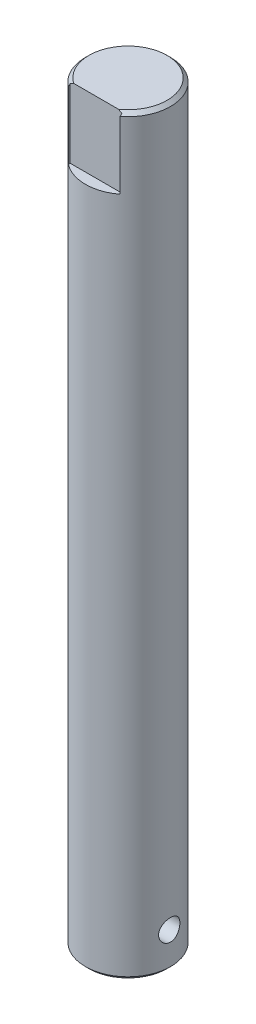
ISO-10303-21;
HEADER;
FILE_DESCRIPTION(('STEP AP214'),'2;1');
FILE_NAME('part.step','',(''),(''),'','','');
FILE_SCHEMA(('AUTOMOTIVE_DESIGN { 1 0 10303 214 1 1 1 1 }'));
ENDSEC;
DATA;
#1=APPLICATION_CONTEXT('core data for automotive mechanical design processes');
#2=APPLICATION_PROTOCOL_DEFINITION('international standard','automotive_design',2000,#1);
#3=PRODUCT_CONTEXT('',#1,'mechanical');
#4=PRODUCT('Part','Part','',(#3));
#5=PRODUCT_RELATED_PRODUCT_CATEGORY('part','',(#4));
#6=PRODUCT_DEFINITION_FORMATION('','',#4);
#7=PRODUCT_DEFINITION_CONTEXT('part definition',#1,'design');
#8=PRODUCT_DEFINITION('design','',#6,#7);
#9=PRODUCT_DEFINITION_SHAPE('','',#8);
#10=(LENGTH_UNIT() NAMED_UNIT(*) SI_UNIT(.MILLI.,.METRE.));
#11=(NAMED_UNIT(*) PLANE_ANGLE_UNIT() SI_UNIT($,.RADIAN.));
#12=(NAMED_UNIT(*) SI_UNIT($,.STERADIAN.) SOLID_ANGLE_UNIT());
#13=UNCERTAINTY_MEASURE_WITH_UNIT(LENGTH_MEASURE(1.E-05),#10,'distance_accuracy_value','');
#14=(GEOMETRIC_REPRESENTATION_CONTEXT(3) GLOBAL_UNCERTAINTY_ASSIGNED_CONTEXT((#13)) GLOBAL_UNIT_ASSIGNED_CONTEXT((#10,
#11,#12)) REPRESENTATION_CONTEXT('',''));
#15=CARTESIAN_POINT('',(0.,0.,0.));
#16=DIRECTION('',(0.,0.,1.));
#17=DIRECTION('',(1.,0.,0.));
#18=AXIS2_PLACEMENT_3D('',#15,#16,#17);
#19=CARTESIAN_POINT('',(0.,106.,0.));
#20=DIRECTION('',(0.,-1.,0.));
#21=DIRECTION('',(0.,0.,-1.));
#22=AXIS2_PLACEMENT_3D('',#19,#20,#21);
#23=CYLINDRICAL_SURFACE('',#22,6.);
#24=CARTESIAN_POINT('',(-6.,3.5,0.));
#25=CARTESIAN_POINT('',(-5.99999859868012,3.50000232573816,-0.082876088669731));
#26=CARTESIAN_POINT('',(-5.99826578131828,3.50689155077379,-0.165778157830763));
#27=CARTESIAN_POINT('',(-5.99152113829892,3.534225151307,-0.329206323770533));
#28=CARTESIAN_POINT('',(-5.98650745419968,3.55467720953785,-0.409731046870739));
#29=CARTESIAN_POINT('',(-5.9737562633204,3.60843925346209,-0.566020872182577));
#30=CARTESIAN_POINT('',(-5.96602202842087,3.64173379871528,-0.641791563430003));
#31=CARTESIAN_POINT('',(-5.94865343807593,3.72018139004483,-0.786672131904427));
#32=CARTESIAN_POINT('',(-5.9390190185405,3.76533483611894,-0.85578178434876));
#33=CARTESIAN_POINT('',(-5.91867413591801,3.86720078965421,-0.98680192730092));
#34=CARTESIAN_POINT('',(-5.90794707148533,3.92411157495918,-1.04855569006107));
#35=CARTESIAN_POINT('',(-5.88673620117529,4.04745220490892,-1.1617489272033));
#36=CARTESIAN_POINT('',(-5.87625242288348,4.1138831229465,-1.21318723694914));
#37=CARTESIAN_POINT('',(-5.8565477569971,4.25559522673744,-1.30502654279903));
#38=CARTESIAN_POINT('',(-5.84734794470605,4.3309932308104,-1.34525221592536));
#39=CARTESIAN_POINT('',(-5.83149494812223,4.48774841165836,-1.41239690855053));
#40=CARTESIAN_POINT('',(-5.82484135672789,4.56910463332576,-1.43931805543933));
#41=CARTESIAN_POINT('',(-5.81500476717551,4.73374349820248,-1.47855483680429));
#42=CARTESIAN_POINT('',(-5.81175491075426,4.8169548960498,-1.49115226833334));
#43=CARTESIAN_POINT('',(-5.80889362537741,4.98436856901398,-1.50226177506785));
#44=CARTESIAN_POINT('',(-5.80928160448643,5.06857068069861,-1.50077614181798));
#45=CARTESIAN_POINT('',(-5.81359205496618,5.23341580774448,-1.48398652463928));
#46=CARTESIAN_POINT('',(-5.81742863001879,5.3140956214651,-1.46901834019052));
#47=CARTESIAN_POINT('',(-5.82806709676483,5.47176105091129,-1.42622418690311));
#48=CARTESIAN_POINT('',(-5.83486919970696,5.54874640302898,-1.39839730206942));
#49=CARTESIAN_POINT('',(-5.85075113904186,5.69773801625207,-1.33038947793715));
#50=CARTESIAN_POINT('',(-5.85985327469421,5.76968617178955,-1.29008666723291));
#51=CARTESIAN_POINT('',(-5.87929710846386,5.90591870975684,-1.19835627601495));
#52=CARTESIAN_POINT('',(-5.88963902334735,5.97020174806726,-1.14692674880884));
#53=CARTESIAN_POINT('',(-5.91075880539781,6.0912036156944,-1.03266342468122));
#54=CARTESIAN_POINT('',(-5.92154069477971,6.14765449006135,-0.96954625816586));
#55=CARTESIAN_POINT('',(-5.94205965578786,6.24922124246391,-0.8346119175037));
#56=CARTESIAN_POINT('',(-5.95179669549415,6.29433677426357,-0.762794477707944));
#57=CARTESIAN_POINT('',(-5.96917732094182,6.37205058622439,-0.612115888681392));
#58=CARTESIAN_POINT('',(-5.97681360127725,6.40460534025443,-0.533231393208624));
#59=CARTESIAN_POINT('',(-5.98907916991418,6.45591730570957,-0.370876008142883));
#60=CARTESIAN_POINT('',(-5.99370903339281,6.47467715641814,-0.287405999150485));
#61=CARTESIAN_POINT('',(-5.99935499271374,6.49745756555884,-0.120539970390027));
#62=CARTESIAN_POINT('',(-6.00046053508278,6.5018430260753,-0.0371967199882097));
#63=CARTESIAN_POINT('',(-5.99918804814451,6.49675099794451,0.129032874801508));
#64=CARTESIAN_POINT('',(-5.99681033241846,6.48727475720087,0.211919259644595));
#65=CARTESIAN_POINT('',(-5.98889581127357,6.45502909160862,0.373614268776491));
#66=CARTESIAN_POINT('',(-5.98340634185811,6.43245873652301,0.452465118968754));
#67=CARTESIAN_POINT('',(-5.96988706634134,6.37489291597155,0.605257292452511));
#68=CARTESIAN_POINT('',(-5.96185700369892,6.33989619568683,0.679198119032634));
#69=CARTESIAN_POINT('',(-5.9439330792631,6.25776387112527,0.821523134429847));
#70=CARTESIAN_POINT('',(-5.93400867366932,6.21042388760324,0.88978544183583));
#71=CARTESIAN_POINT('',(-5.91344509187419,6.10521009120303,1.01752661364325));
#72=CARTESIAN_POINT('',(-5.90280579251705,6.04733446038309,1.07700395897301));
#73=CARTESIAN_POINT('',(-5.88168956960771,5.92099803915554,1.18699056807273));
#74=CARTESIAN_POINT('',(-5.87122304187281,5.85231229699758,1.23724386762203));
#75=CARTESIAN_POINT('',(-5.85192878377239,5.70726736553428,1.3255107590127));
#76=CARTESIAN_POINT('',(-5.84310098067026,5.63090851704025,1.36352489415794));
#77=CARTESIAN_POINT('',(-5.82818094734665,5.47309427758692,1.42595142060929));
#78=CARTESIAN_POINT('',(-5.82207255291905,5.39167237165599,1.45044439665407));
#79=CARTESIAN_POINT('',(-5.81326744090183,5.22569036211089,1.48534565995378));
#80=CARTESIAN_POINT('',(-5.81056997719936,5.14113094896751,1.49575702747866));
#81=CARTESIAN_POINT('',(-5.80894901203957,4.9738789761448,1.50203859033399));
#82=CARTESIAN_POINT('',(-5.80991932728263,4.89120256487527,1.49831789778012));
#83=CARTESIAN_POINT('',(-5.81527909007842,4.72769611133202,1.47737727831287));
#84=CARTESIAN_POINT('',(-5.81966846891856,4.64686603198635,1.46015762268677));
#85=CARTESIAN_POINT('',(-5.83131260682722,4.48979154093459,1.41293131944279));
#86=CARTESIAN_POINT('',(-5.83855015236309,4.41352269475979,1.38300140468038));
#87=CARTESIAN_POINT('',(-5.85507755724829,4.26703461728631,1.31126491360507));
#88=CARTESIAN_POINT('',(-5.86436770120773,4.19681622681308,1.26945669003419));
#89=CARTESIAN_POINT('',(-5.88425634263512,4.06244537099798,1.17386774863714));
#90=CARTESIAN_POINT('',(-5.89488264831757,3.99849892657604,1.11980316291225));
#91=CARTESIAN_POINT('',(-5.91608027246285,3.88045295520459,1.00178937118974));
#92=CARTESIAN_POINT('',(-5.92665157727059,3.82635576988703,0.937837821261146));
#93=CARTESIAN_POINT('',(-5.94677655647663,3.72858869143539,0.80046758670259));
#94=CARTESIAN_POINT('',(-5.95630833365868,3.68512538632842,0.726898422316387));
#95=CARTESIAN_POINT('',(-5.97304924975118,3.61125253705947,0.573266059510477));
#96=CARTESIAN_POINT('',(-5.98026005199781,3.58083363935146,0.49320756343674));
#97=CARTESIAN_POINT('',(-5.99048059565541,3.53842816967035,0.344410253243472));
#98=CARTESIAN_POINT('',(-5.9940258505269,3.52404875694657,0.276380170908069));
#99=CARTESIAN_POINT('',(-5.99878605231948,3.50483405637806,0.138906071536283));
#100=CARTESIAN_POINT('',(-6.00000117450894,3.4999980506947,0.0694621612426163));
#101=CARTESIAN_POINT('',(-6.,3.5,0.));
#102=B_SPLINE_CURVE_WITH_KNOTS('',3,(#24,#25,#26,#27,#28,#29,#30,#31,#32,#33,#34,#35,#36,#37,
#38,#39,#40,#41,#42,#43,#44,#45,#46,#47,#48,#49,#50,#51,#52,#53,#54,#55,#56,#57,#58,#59,#60,#61,
#62,#63,#64,#65,#66,#67,#68,#69,#70,#71,#72,#73,#74,#75,#76,#77,#78,#79,#80,#81,#82,#83,#84,#85,
#86,#87,#88,#89,#90,#91,#92,#93,#94,#95,#96,#97,#98,#99,#100,#101),.UNSPECIFIED.,.T.,.F.,(4,2,2,
2,2,2,2,2,2,2,2,2,2,2,2,2,2,2,2,2,2,2,2,2,2,2,2,2,2,2,2,2,2,2,2,2,2,2,4),(0.,0.24837371247189,
0.4968882377639,0.745104902286106,0.993329940169328,1.24614435437139,1.49898729580062,
1.75558647545807,2.01214461169369,2.2635629509943,2.51494038112697,2.76022497007018,
3.00552703466038,3.25330527873879,3.50112690836163,3.75601500969019,4.01091089558247,
4.26668229009114,4.52240473688643,4.77158308949276,5.02073901112743,5.26620274514037,
5.51169127322291,5.76153587565352,6.01142363008019,6.26744509204476,6.52345518749508,
6.77792254614037,7.03233423252408,7.27943780398613,7.52653640956034,7.77216400559447,
8.01782568136901,8.2698957640991,8.52202569770418,8.77872185499588,9.0352336382135,
9.24342242942149,9.4515955604304),.UNSPECIFIED.);
#103=CARTESIAN_POINT('',(-6.,3.5,0.));
#104=VERTEX_POINT('',#103);
#105=EDGE_CURVE('E157',#104,#104,#102,.T.);
#106=ORIENTED_EDGE('',*,*,#105,.T.);
#107=EDGE_LOOP('',(#106));
#108=FACE_BOUND('',#107,.T.);
#109=CARTESIAN_POINT('',(5.80947501931112,5.,-1.5));
#110=CARTESIAN_POINT('',(5.80947660051185,4.91716954944523,-1.49999764715507));
#111=CARTESIAN_POINT('',(5.81126583608348,4.8343130607932,-1.49311574729838));
#112=CARTESIAN_POINT('',(5.81821117195949,4.67097945309558,-1.46581387527848));
#113=CARTESIAN_POINT('',(5.82336923173088,4.590503747319,-1.44538602404532));
#114=CARTESIAN_POINT('',(5.8364323475758,4.43431787708778,-1.39169471977917));
#115=CARTESIAN_POINT('',(5.84433385614245,4.3586017067686,-1.35844783671268));
#116=CARTESIAN_POINT('',(5.86198915217285,4.21381348847605,-1.28011268475685));
#117=CARTESIAN_POINT('',(5.87174301827101,4.14474172275186,-1.23502391313642));
#118=CARTESIAN_POINT('',(5.89224429813367,4.01368301284268,-1.13322505638713));
#119=CARTESIAN_POINT('',(5.90300758573818,3.95186383978997,-1.07630213262243));
#120=CARTESIAN_POINT('',(5.92417725309178,3.83854316338379,-0.952909238460399));
#121=CARTESIAN_POINT('',(5.93458359939834,3.78704262462695,-0.886438376508184));
#122=CARTESIAN_POINT('',(5.95404249312349,3.69513471942123,-0.744687120647373));
#123=CARTESIAN_POINT('',(5.96307412440355,3.65489216710312,-0.669296745717072));
#124=CARTESIAN_POINT('',(5.9785848715559,3.58771421350815,-0.512557910575657));
#125=CARTESIAN_POINT('',(5.98506436400607,3.56077684885069,-0.431210331475164));
#126=CARTESIAN_POINT('',(5.99462855308908,3.52151129925285,-0.266615255252497));
#127=CARTESIAN_POINT('',(5.99777936306588,3.50889821340405,-0.183439631729385));
#128=CARTESIAN_POINT('',(6.00056156464378,3.49774497243467,-0.0160972915576618));
#129=CARTESIAN_POINT('',(6.00019347658022,3.49920273667424,0.068069276722841));
#130=CARTESIAN_POINT('',(5.99602856972121,3.51594491015009,0.233028370758581));
#131=CARTESIAN_POINT('',(5.99230801404524,3.53092179503231,0.3138543234016));
#132=CARTESIAN_POINT('',(5.98194501914912,3.5737827620291,0.471807371120529));
#133=CARTESIAN_POINT('',(5.97530242439064,3.60166753122645,0.548934269055657));
#134=CARTESIAN_POINT('',(5.95972505820537,3.66980154241224,0.69811005525271));
#135=CARTESIAN_POINT('',(5.95077011817032,3.71016022679705,0.770106764649757));
#136=CARTESIAN_POINT('',(5.93153942285789,3.80201340746975,0.906413433510733));
#137=CARTESIAN_POINT('',(5.92126343791494,3.85350984113637,0.970722052628258));
#138=CARTESIAN_POINT('',(5.90018228261712,3.96782524518943,1.09166105262743));
#139=CARTESIAN_POINT('',(5.88937031715551,4.03091293540866,1.1480365186128));
#140=CARTESIAN_POINT('',(5.86869026110024,4.16575998412415,1.24946456394453));
#141=CARTESIAN_POINT('',(5.85882221463582,4.2375197476946,1.29451661406902));
#142=CARTESIAN_POINT('',(5.84112298098989,4.38817402048938,1.3721821935339));
#143=CARTESIAN_POINT('',(5.83330190235432,4.46710143818792,1.40473435045574));
#144=CARTESIAN_POINT('',(5.82071184083974,4.62955128084587,1.45602843095451));
#145=CARTESIAN_POINT('',(5.81594220486131,4.71307271838988,1.47477330982936));
#146=CARTESIAN_POINT('',(5.81013213623484,4.87997570091387,1.49749778319911));
#147=CARTESIAN_POINT('',(5.80899653456189,4.96330267599778,1.50185428435178));
#148=CARTESIAN_POINT('',(5.81032406088623,5.12949316194689,1.49671019430933));
#149=CARTESIAN_POINT('',(5.81278685760759,5.21235671477074,1.48721087870928));
#150=CARTESIAN_POINT('',(5.82094249172736,5.37386855897282,1.4549552783626));
#151=CARTESIAN_POINT('',(5.82658182140625,5.45256363594251,1.43241844096905));
#152=CARTESIAN_POINT('',(5.84040430962577,5.60505887471101,1.37497084900237));
#153=CARTESIAN_POINT('',(5.84858776949168,5.6788584554332,1.34005862862753));
#154=CARTESIAN_POINT('',(5.86677682255957,5.82106476672041,1.25806240076193));
#155=CARTESIAN_POINT('',(5.87681501163985,5.88933730402586,1.21075305230138));
#156=CARTESIAN_POINT('',(5.89750249843029,6.01711301768081,1.10559043940168));
#157=CARTESIAN_POINT('',(5.90815189637082,6.07661474999004,1.04773544220816));
#158=CARTESIAN_POINT('',(5.92918441818963,6.18668662554257,0.921394081477089));
#159=CARTESIAN_POINT('',(5.93955421237101,6.23699603752929,0.852677928797389));
#160=CARTESIAN_POINT('',(5.9585832996824,6.32536152017075,0.707554024042013));
#161=CARTESIAN_POINT('',(5.96724268202376,6.36341822996492,0.631146673436387));
#162=CARTESIAN_POINT('',(5.98182069442988,6.42586762071676,0.473337302596636));
#163=CARTESIAN_POINT('',(5.98775898013446,6.45035857062744,0.391976071541822));
#164=CARTESIAN_POINT('',(5.99631176037473,6.48527620076505,0.226124640478212));
#165=CARTESIAN_POINT('',(5.99892689636045,6.49570559524343,0.141635047561866));
#166=CARTESIAN_POINT('',(6.00051254113217,6.5020513843633,-0.0256252896649888));
#167=CARTESIAN_POINT('',(5.99957968320012,6.49835256364309,-0.108380740449049));
#168=CARTESIAN_POINT('',(5.99438844686135,6.4774282590585,-0.272051244622109));
#169=CARTESIAN_POINT('',(5.99013016735642,6.46020317748035,-0.352966352671329));
#170=CARTESIAN_POINT('',(5.97878149280944,6.41292167034361,-0.510256553467223));
#171=CARTESIAN_POINT('',(5.97170646753999,6.38293482002806,-0.586653741871528));
#172=CARTESIAN_POINT('',(5.95546933370076,6.31104413147101,-0.733375579562202));
#173=CARTESIAN_POINT('',(5.94630696206604,6.26913879099565,-0.803699461897577));
#174=CARTESIAN_POINT('',(5.92660874521999,6.17342714900439,-0.938102892635848));
#175=CARTESIAN_POINT('',(5.91604525418417,6.11935978563893,-1.00199248245088));
#176=CARTESIAN_POINT('',(5.89485973579863,6.0013657220393,-1.11992253040688));
#177=CARTESIAN_POINT('',(5.88423769428833,5.93743652585314,-1.17396048760228));
#178=CARTESIAN_POINT('',(5.86391213790822,5.800097878698,-1.27164303971884));
#179=CARTESIAN_POINT('',(5.85422945594827,5.72653381488106,-1.31507492916982));
#180=CARTESIAN_POINT('',(5.83715933325923,5.57291676511595,-1.3888903449235));
#181=CARTESIAN_POINT('',(5.82977022370054,5.49286855083989,-1.41928336463958));
#182=CARTESIAN_POINT('',(5.81927863109675,5.34413448225993,-1.46163379284816));
#183=CARTESIAN_POINT('',(5.8156299450082,5.27616025342421,-1.47598975589307));
#184=CARTESIAN_POINT('',(5.81072757878358,5.13879669650006,-1.4951734388599));
#185=CARTESIAN_POINT('',(5.80947369434945,5.06940748963241,-1.50000197155828));
#186=CARTESIAN_POINT('',(5.80947501931112,5.,-1.5));
#187=B_SPLINE_CURVE_WITH_KNOTS('',3,(#109,#110,#111,#112,#113,#114,#115,#116,#117,#118,#119,
#120,#121,#122,#123,#124,#125,#126,#127,#128,#129,#130,#131,#132,#133,#134,#135,#136,#137,#138,
#139,#140,#141,#142,#143,#144,#145,#146,#147,#148,#149,#150,#151,#152,#153,#154,#155,#156,#157,
#158,#159,#160,#161,#162,#163,#164,#165,#166,#167,#168,#169,#170,#171,#172,#173,#174,#175,#176,
#177,#178,#179,#180,#181,#182,#183,#184,#185,#186),.UNSPECIFIED.,.T.,.F.,(4,2,2,2,2,2,2,2,2,2,2,
2,2,2,2,2,2,2,2,2,2,2,2,2,2,2,2,2,2,2,2,2,2,2,2,2,2,2,4),(0.,0.248236465041681,0.4966174448572,
0.744678436299612,0.99274996053287,1.24574372515786,1.4987611288792,1.75530897838752,
2.01181895908255,2.26313250597208,2.51440889199612,2.76010957613368,3.00582334034872,
3.25375724552667,3.50173431281348,3.75642279943147,4.01112318719881,4.26705859205041,
4.52293920077728,4.7720614485703,5.02116076310281,5.26618443005524,5.5112371285285,
5.76109707515494,6.01099811331027,6.26715198579191,6.52329249431732,6.77755243684158,
7.03176329345423,7.27910067676474,7.52643070426189,7.77242925935826,8.01845883442843,
8.27038257949242,8.52237018939305,8.77905886370806,9.03556032819972,9.24358696306398,
9.45159585059712),.UNSPECIFIED.);
#188=CARTESIAN_POINT('',(5.80947501931112,5.,-1.5));
#189=VERTEX_POINT('',#188);
#190=EDGE_CURVE('E148',#189,#189,#187,.T.);
#191=ORIENTED_EDGE('',*,*,#190,.T.);
#192=EDGE_LOOP('',(#191));
#193=FACE_BOUND('',#192,.T.);
#194=CARTESIAN_POINT('',(0.,0.499999999999987,0.));
#195=DIRECTION('',(0.,1.,0.));
#196=DIRECTION('',(0.,0.,1.));
#197=AXIS2_PLACEMENT_3D('',#194,#195,#196);
#198=CIRCLE('',#197,6.);
#199=CARTESIAN_POINT('',(0.,0.499999999999987,6.));
#200=VERTEX_POINT('',#199);
#201=EDGE_CURVE('E136',#200,#200,#198,.T.);
#202=ORIENTED_EDGE('',*,*,#201,.T.);
#203=EDGE_LOOP('',(#202));
#204=FACE_BOUND('',#203,.T.);
#205=DIRECTION('',(0.,-1.,0.));
#206=VECTOR('',#205,1.);
#207=CARTESIAN_POINT('',(3.65140082098661,106.,4.7610158626598));
#208=LINE('',#207,#206);
#209=CARTESIAN_POINT('',(3.65140082098661,96.,4.7610158626598));
#210=VERTEX_POINT('',#209);
#211=CARTESIAN_POINT('',(3.65140082098661,105.5,4.7610158626598));
#212=VERTEX_POINT('',#211);
#213=EDGE_CURVE('E72',#210,#212,#208,.F.);
#214=ORIENTED_EDGE('',*,*,#213,.F.);
#215=CARTESIAN_POINT('',(0.,96.,0.));
#216=DIRECTION('',(0.,1.,0.));
#217=DIRECTION('',(0.,0.,1.));
#218=AXIS2_PLACEMENT_3D('',#215,#216,#217);
#219=CIRCLE('',#218,6.);
#220=CARTESIAN_POINT('',(-3.65140082098661,96.,4.7610158626598));
#221=VERTEX_POINT('',#220);
#222=EDGE_CURVE('E11',#221,#210,#219,.T.);
#223=ORIENTED_EDGE('',*,*,#222,.F.);
#224=DIRECTION('',(0.,-1.,0.));
#225=VECTOR('',#224,1.);
#226=CARTESIAN_POINT('',(-3.65140082098661,106.,4.7610158626598));
#227=LINE('',#226,#225);
#228=CARTESIAN_POINT('',(-3.65140082098661,105.5,4.7610158626598));
#229=VERTEX_POINT('',#228);
#230=EDGE_CURVE('E104',#229,#221,#227,.T.);
#231=ORIENTED_EDGE('',*,*,#230,.F.);
#232=CARTESIAN_POINT('',(0.,105.5,0.));
#233=DIRECTION('',(0.,1.,0.));
#234=DIRECTION('',(0.,0.,1.));
#235=AXIS2_PLACEMENT_3D('',#232,#233,#234);
#236=CIRCLE('',#235,6.);
#237=EDGE_CURVE('E132',#229,#212,#236,.F.);
#238=ORIENTED_EDGE('',*,*,#237,.T.);
#239=EDGE_LOOP('',(#214,#223,#231,#238));
#240=FACE_BOUND('',#239,.T.);
#241=ADVANCED_FACE('F47',(#108,#193,#204,#240),#23,.T.);
#242=CARTESIAN_POINT('',(0.,106.,0.));
#243=DIRECTION('',(0.,1.,0.));
#244=DIRECTION('',(0.,0.,1.));
#245=AXIS2_PLACEMENT_3D('',#242,#243,#244);
#246=PLANE('',#245);
#247=CARTESIAN_POINT('',(0.,106.,0.));
#248=DIRECTION('',(0.,1.,0.));
#249=DIRECTION('',(0.,0.,1.));
#250=AXIS2_PLACEMENT_3D('',#247,#248,#249);
#251=CIRCLE('',#250,5.50000000000001);
#252=CARTESIAN_POINT('',(3.16227766016839,106.,4.5));
#253=VERTEX_POINT('',#252);
#254=CARTESIAN_POINT('',(-3.16227766016839,106.,4.5));
#255=VERTEX_POINT('',#254);
#256=EDGE_CURVE('E144',#253,#255,#251,.T.);
#257=ORIENTED_EDGE('',*,*,#256,.T.);
#258=DIRECTION('',(1.,0.,0.));
#259=VECTOR('',#258,1.);
#260=CARTESIAN_POINT('',(0.,106.,4.5));
#261=LINE('',#260,#259);
#262=EDGE_CURVE('E109',#255,#253,#261,.T.);
#263=ORIENTED_EDGE('',*,*,#262,.T.);
#264=EDGE_LOOP('',(#257,#263));
#265=FACE_BOUND('',#264,.T.);
#266=ADVANCED_FACE('F174',(#265),#246,.T.);
#267=CARTESIAN_POINT('',(0.,106.,0.));
#268=DIRECTION('',(0.,-1.,0.));
#269=DIRECTION('',(0.,0.,-1.));
#270=AXIS2_PLACEMENT_3D('',#267,#268,#269);
#271=CONICAL_SURFACE('',#270,5.50000000000001,0.785398163397441);
#272=ORIENTED_EDGE('',*,*,#237,.F.);
#273=CARTESIAN_POINT('',(-3.65140082098661,103.918661169916,6.64409290280039));
#274=CARTESIAN_POINT('',(-3.65140082098661,104.048560693195,6.49584710837821));
#275=CARTESIAN_POINT('',(-3.65140082098661,104.177912994654,6.34711721884898));
#276=CARTESIAN_POINT('',(-3.65140082098661,104.435238230954,6.04846690777909));
#277=CARTESIAN_POINT('',(-3.65140082098661,104.563211151115,5.89854647359728));
#278=CARTESIAN_POINT('',(-3.65140082098661,104.817315311971,5.59750274581671));
#279=CARTESIAN_POINT('',(-3.65140082098661,104.943448840669,5.4463813870374));
#280=CARTESIAN_POINT('',(-3.65140082098661,105.193654547247,5.14244278901479));
#281=CARTESIAN_POINT('',(-3.65140082098661,105.317726757454,4.98962557642958));
#282=CARTESIAN_POINT('',(-3.65140082098661,105.563420051187,4.68175958171262));
#283=CARTESIAN_POINT('',(-3.65140082098661,105.68503836863,4.52670858583052));
#284=CARTESIAN_POINT('',(-3.65140082098661,105.924950864987,4.21408276595877));
#285=CARTESIAN_POINT('',(-3.65140082098661,106.043245494426,4.05650828861594));
#286=CARTESIAN_POINT('',(-3.65140082098661,106.27569840551,3.73797999961823));
#287=CARTESIAN_POINT('',(-3.65140082098661,106.389850725892,3.57702180621947));
#288=CARTESIAN_POINT('',(-3.65140082098661,106.556784051812,3.33259481667201));
#289=CARTESIAN_POINT('',(-3.65140082098661,106.611725081542,3.25060118547128));
#290=CARTESIAN_POINT('',(-3.65140082098661,106.719921638231,3.08549724552021));
#291=CARTESIAN_POINT('',(-3.65140082098661,106.773176975164,3.00238681236752));
#292=CARTESIAN_POINT('',(-3.65140082098661,106.825461415254,2.91866116991582));
#293=B_SPLINE_CURVE_WITH_KNOTS('',3,(#273,#274,#275,#276,#277,#278,#279,#280,#281,#282,#283,
#284,#285,#286,#287,#288,#289,#290,#291,#292),.UNSPECIFIED.,.F.,.F.,(4,2,2,2,2,2,2,2,2,4),(0.,
0.591321245272726,1.18264877758431,1.77316417030088,2.36367029348322,2.95480854700153,
3.54586628169239,4.13774336029257,4.43382154784489,4.72993299401003),.UNSPECIFIED.);
#294=CARTESIAN_POINT('',(-3.65140082098661,105.704939348419,4.5));
#295=VERTEX_POINT('',#294);
#296=EDGE_CURVE('E58',#229,#295,#293,.T.);
#297=ORIENTED_EDGE('',*,*,#296,.T.);
#298=CARTESIAN_POINT('',(-3.65210082098661,105.704498261009,4.5));
#299=CARTESIAN_POINT('',(-3.56414571310069,105.759917862974,4.5));
#300=CARTESIAN_POINT('',(-3.47565276550761,105.814482596728,4.5));
#301=CARTESIAN_POINT('',(-3.29745250091329,105.921639077341,4.5));
#302=CARTESIAN_POINT('',(-3.20774489625122,105.974230345305,4.5));
#303=CARTESIAN_POINT('',(-2.93589934981148,106.129040169688,4.5));
#304=CARTESIAN_POINT('',(-2.75177327624084,106.227825903665,4.5));
#305=CARTESIAN_POINT('',(-2.37308166422444,106.415334639316,4.5));
#306=CARTESIAN_POINT('',(-2.17837319834051,106.503772271826,4.5));
#307=CARTESIAN_POINT('',(-1.78217953905082,106.663324921866,4.5));
#308=CARTESIAN_POINT('',(-1.58070668840414,106.73446972568,4.5));
#309=CARTESIAN_POINT('',(-1.24403763017052,106.832910389022,4.5));
#310=CARTESIAN_POINT('',(-1.11077161030434,106.866800674659,4.5));
#311=CARTESIAN_POINT('',(-0.841911512536729,106.923803504924,4.5));
#312=CARTESIAN_POINT('',(-0.706317401639333,106.946915896668,4.5));
#313=CARTESIAN_POINT('',(-0.43502029800086,106.98100332949,4.5));
#314=CARTESIAN_POINT('',(-0.299333020862281,106.992101769922,4.5));
#315=CARTESIAN_POINT('',(-0.0275104345832268,107.001965372031,4.5));
#316=CARTESIAN_POINT('',(0.108624848293863,107.000731244243,4.5));
#317=CARTESIAN_POINT('',(0.380184971050899,106.986004361451,4.5));
#318=CARTESIAN_POINT('',(0.515609981738215,106.972514703739,4.5));
#319=CARTESIAN_POINT('',(0.784802940494018,106.934022052546,4.5));
#320=CARTESIAN_POINT('',(0.918570704384849,106.909017790971,4.5));
#321=CARTESIAN_POINT('',(1.18505771706025,106.848404073781,4.5));
#322=CARTESIAN_POINT('',(1.31775311554979,106.812691098221,4.5));
#323=CARTESIAN_POINT('',(1.58033337307438,106.732209468394,4.5));
#324=CARTESIAN_POINT('',(1.71021821982452,106.687440774553,4.5));
#325=CARTESIAN_POINT('',(1.99966131643341,106.577966837848,4.5));
#326=CARTESIAN_POINT('',(2.15839155697685,106.51108488613,4.5));
#327=CARTESIAN_POINT('',(2.47155936069461,106.36782596906,4.5));
#328=CARTESIAN_POINT('',(2.62599439581221,106.291443550853,4.5));
#329=CARTESIAN_POINT('',(2.92765394341778,106.132971168809,4.5));
#330=CARTESIAN_POINT('',(3.07496206767504,106.051038806368,4.5));
#331=CARTESIAN_POINT('',(3.36601685562462,105.881612423275,4.5));
#332=CARTESIAN_POINT('',(3.50976919922772,105.794128191928,4.5));
#333=CARTESIAN_POINT('',(3.65210082098661,105.704498261009,4.5));
#334=B_SPLINE_CURVE_WITH_KNOTS('',3,(#298,#299,#300,#301,#302,#303,#304,#305,#306,#307,#308,
#309,#310,#311,#312,#313,#314,#315,#316,#317,#318,#319,#320,#321,#322,#323,#324,#325,#326,#327,
#328,#329,#330,#331,#332,#333),.UNSPECIFIED.,.F.,.F.,(4,2,2,2,2,2,2,2,2,2,2,2,2,2,2,2,2,4),(0.,
0.311866541120881,0.623808278693097,1.25030359682258,1.89127982199032,2.53114403765084,
2.94329281877453,3.35544744610117,3.76332730654328,4.17118366733073,4.57893698083286,
4.98673521056079,5.39861014858435,5.81048688654549,6.32681448891323,6.84343982034474,
7.34898176726158,7.85365583755379),.UNSPECIFIED.);
#335=EDGE_CURVE('E115',#295,#255,#334,.T.);
#336=ORIENTED_EDGE('',*,*,#335,.T.);
#337=ORIENTED_EDGE('',*,*,#256,.F.);
#338=CARTESIAN_POINT('',(3.65140082098661,105.704939348419,4.5));
#339=VERTEX_POINT('',#338);
#340=EDGE_CURVE('E202',#253,#339,#334,.T.);
#341=ORIENTED_EDGE('',*,*,#340,.T.);
#342=CARTESIAN_POINT('',(3.65140082098661,106.825461415254,2.91866116991581));
#343=CARTESIAN_POINT('',(3.65140082098661,106.773176975164,3.00238681236751));
#344=CARTESIAN_POINT('',(3.65140082098661,106.719921638231,3.0854972455202));
#345=CARTESIAN_POINT('',(3.65140082098661,106.611725081542,3.25060118547126));
#346=CARTESIAN_POINT('',(3.65140082098661,106.556784051812,3.33259481667198));
#347=CARTESIAN_POINT('',(3.65140082098661,106.389850725892,3.57702180621942));
#348=CARTESIAN_POINT('',(3.65140082098661,106.27569840551,3.73797999961818));
#349=CARTESIAN_POINT('',(3.65140082098661,106.043245494426,4.05650828861588));
#350=CARTESIAN_POINT('',(3.65140082098661,105.924950864987,4.2140827659587));
#351=CARTESIAN_POINT('',(3.65140082098661,105.68503836863,4.52670858583044));
#352=CARTESIAN_POINT('',(3.65140082098661,105.563420051187,4.68175958171254));
#353=CARTESIAN_POINT('',(3.65140082098661,105.317726757454,4.98962557642948));
#354=CARTESIAN_POINT('',(3.65140082098661,105.193654547247,5.14244278901469));
#355=CARTESIAN_POINT('',(3.65140082098661,104.943448840669,5.44638138703728));
#356=CARTESIAN_POINT('',(3.65140082098661,104.817315311972,5.59750274581658));
#357=CARTESIAN_POINT('',(3.65140082098661,104.563211151115,5.89854647359715));
#358=CARTESIAN_POINT('',(3.65140082098661,104.435238230954,6.04846690777894));
#359=CARTESIAN_POINT('',(3.65140082098661,104.177912994654,6.34711721884882));
#360=CARTESIAN_POINT('',(3.65140082098661,104.048560693195,6.49584710837805));
#361=CARTESIAN_POINT('',(3.65140082098661,103.918661169916,6.64409290280023));
#362=B_SPLINE_CURVE_WITH_KNOTS('',3,(#342,#343,#344,#345,#346,#347,#348,#349,#350,#351,#352,
#353,#354,#355,#356,#357,#358,#359,#360,#361),.UNSPECIFIED.,.F.,.F.,(4,2,2,2,2,2,2,2,2,4),(0.,
0.296111446165122,0.592189633717436,1.18406671231757,1.77512444700841,2.3662627005267,
2.95676882370901,3.54728421642555,4.1386117487371,4.72993299400981),.UNSPECIFIED.);
#363=EDGE_CURVE('E200',#339,#212,#362,.T.);
#364=ORIENTED_EDGE('',*,*,#363,.T.);
#365=EDGE_LOOP('',(#272,#297,#336,#337,#341,#364));
#366=FACE_BOUND('',#365,.T.);
#367=ADVANCED_FACE('F50',(#366),#271,.T.);
#368=CARTESIAN_POINT('',(0.,0.,0.));
#369=DIRECTION('',(0.,1.,0.));
#370=DIRECTION('',(0.,0.,1.));
#371=AXIS2_PLACEMENT_3D('',#368,#369,#370);
#372=PLANE('',#371);
#373=CARTESIAN_POINT('',(0.,0.,0.));
#374=DIRECTION('',(0.,1.,0.));
#375=DIRECTION('',(0.,0.,1.));
#376=AXIS2_PLACEMENT_3D('',#373,#374,#375);
#377=CIRCLE('',#376,5.50000000000001);
#378=CARTESIAN_POINT('',(0.,0.,5.50000000000001));
#379=VERTEX_POINT('',#378);
#380=EDGE_CURVE('E140',#379,#379,#377,.F.);
#381=ORIENTED_EDGE('',*,*,#380,.T.);
#382=EDGE_LOOP('',(#381));
#383=FACE_BOUND('',#382,.T.);
#384=ADVANCED_FACE('F178',(#383),#372,.F.);
#385=CARTESIAN_POINT('',(0.,0.499999999999987,0.));
#386=DIRECTION('',(0.,1.,0.));
#387=DIRECTION('',(0.,0.,1.));
#388=AXIS2_PLACEMENT_3D('',#385,#386,#387);
#389=CONICAL_SURFACE('',#388,6.,0.785398163397455);
#390=ORIENTED_EDGE('',*,*,#380,.F.);
#391=EDGE_LOOP('',(#390));
#392=FACE_BOUND('',#391,.T.);
#393=ORIENTED_EDGE('',*,*,#201,.F.);
#394=EDGE_LOOP('',(#393));
#395=FACE_BOUND('',#394,.T.);
#396=ADVANCED_FACE('F169',(#392,#395),#389,.T.);
#397=CARTESIAN_POINT('',(-6.,5.,0.));
#398=DIRECTION('',(1.,0.,0.));
#399=DIRECTION('',(0.,0.,-1.));
#400=AXIS2_PLACEMENT_3D('',#397,#398,#399);
#401=CYLINDRICAL_SURFACE('',#400,1.5);
#402=ORIENTED_EDGE('',*,*,#190,.F.);
#403=EDGE_LOOP('',(#402));
#404=FACE_BOUND('',#403,.T.);
#405=ORIENTED_EDGE('',*,*,#105,.F.);
#406=EDGE_LOOP('',(#405));
#407=FACE_BOUND('',#406,.T.);
#408=ADVANCED_FACE('F164',(#404,#407),#401,.F.);
#409=CARTESIAN_POINT('',(-3.65140082098661,96.,6.));
#410=DIRECTION('',(0.,1.,0.));
#411=DIRECTION('',(0.,0.,1.));
#412=AXIS2_PLACEMENT_3D('',#409,#410,#411);
#413=PLANE('',#412);
#414=ORIENTED_EDGE('',*,*,#222,.T.);
#415=DIRECTION('',(0.,0.,-1.));
#416=VECTOR('',#415,1.);
#417=CARTESIAN_POINT('',(3.65140082098661,96.,6.));
#418=LINE('',#417,#416);
#419=CARTESIAN_POINT('',(3.65140082098661,96.,4.5));
#420=VERTEX_POINT('',#419);
#421=EDGE_CURVE('E110',#210,#420,#418,.T.);
#422=ORIENTED_EDGE('',*,*,#421,.T.);
#423=DIRECTION('',(1.,0.,0.));
#424=VECTOR('',#423,1.);
#425=CARTESIAN_POINT('',(-3.65140082098661,96.,4.5));
#426=LINE('',#425,#424);
#427=CARTESIAN_POINT('',(-3.65140082098661,96.,4.5));
#428=VERTEX_POINT('',#427);
#429=EDGE_CURVE('E113',#428,#420,#426,.T.);
#430=ORIENTED_EDGE('',*,*,#429,.F.);
#431=DIRECTION('',(0.,0.,-1.));
#432=VECTOR('',#431,1.);
#433=CARTESIAN_POINT('',(-3.65140082098661,96.,6.));
#434=LINE('',#433,#432);
#435=EDGE_CURVE('E98',#221,#428,#434,.T.);
#436=ORIENTED_EDGE('',*,*,#435,.F.);
#437=EDGE_LOOP('',(#414,#422,#430,#436));
#438=FACE_BOUND('',#437,.T.);
#439=ADVANCED_FACE('F118',(#438),#413,.T.);
#440=CARTESIAN_POINT('',(3.65140082098661,112.59727645903,6.));
#441=DIRECTION('',(-1.,0.,0.));
#442=DIRECTION('',(0.,-1.,0.));
#443=AXIS2_PLACEMENT_3D('',#440,#441,#442);
#444=PLANE('',#443);
#445=ORIENTED_EDGE('',*,*,#213,.T.);
#446=ORIENTED_EDGE('',*,*,#363,.F.);
#447=DIRECTION('',(0.,1.,0.));
#448=VECTOR('',#447,1.);
#449=CARTESIAN_POINT('',(3.65140082098661,112.59727645903,4.5));
#450=LINE('',#449,#448);
#451=EDGE_CURVE('E65',#420,#339,#450,.T.);
#452=ORIENTED_EDGE('',*,*,#451,.F.);
#453=ORIENTED_EDGE('',*,*,#421,.F.);
#454=EDGE_LOOP('',(#445,#446,#452,#453));
#455=FACE_BOUND('',#454,.T.);
#456=ADVANCED_FACE('F171',(#455),#444,.T.);
#457=CARTESIAN_POINT('',(-3.65140082098661,112.59727645903,6.));
#458=DIRECTION('',(1.,0.,0.));
#459=DIRECTION('',(0.,1.,0.));
#460=AXIS2_PLACEMENT_3D('',#457,#458,#459);
#461=PLANE('',#460);
#462=ORIENTED_EDGE('',*,*,#230,.T.);
#463=ORIENTED_EDGE('',*,*,#435,.T.);
#464=DIRECTION('',(0.,-1.,0.));
#465=VECTOR('',#464,1.);
#466=CARTESIAN_POINT('',(-3.65140082098661,112.59727645903,4.5));
#467=LINE('',#466,#465);
#468=EDGE_CURVE('E101',#295,#428,#467,.T.);
#469=ORIENTED_EDGE('',*,*,#468,.F.);
#470=ORIENTED_EDGE('',*,*,#296,.F.);
#471=EDGE_LOOP('',(#462,#463,#469,#470));
#472=FACE_BOUND('',#471,.T.);
#473=ADVANCED_FACE('F100',(#472),#461,.T.);
#474=CARTESIAN_POINT('',(0.,0.,4.5));
#475=DIRECTION('',(0.,0.,1.));
#476=DIRECTION('',(1.,0.,0.));
#477=AXIS2_PLACEMENT_3D('',#474,#475,#476);
#478=PLANE('',#477);
#479=ORIENTED_EDGE('',*,*,#468,.T.);
#480=ORIENTED_EDGE('',*,*,#429,.T.);
#481=ORIENTED_EDGE('',*,*,#451,.T.);
#482=ORIENTED_EDGE('',*,*,#340,.F.);
#483=ORIENTED_EDGE('',*,*,#262,.F.);
#484=ORIENTED_EDGE('',*,*,#335,.F.);
#485=EDGE_LOOP('',(#479,#480,#481,#482,#483,#484));
#486=FACE_BOUND('',#485,.T.);
#487=ADVANCED_FACE('F112',(#486),#478,.T.);
#488=CLOSED_SHELL('',(#241,#266,#367,#384,#396,#408,#439,#456,#473,#487));
#489=MANIFOLD_SOLID_BREP('B2',#488);
#490=ADVANCED_BREP_SHAPE_REPRESENTATION('',(#18,#489),#14);
#491=SHAPE_DEFINITION_REPRESENTATION(#9,#490);
ENDSEC;
END-ISO-10303-21;
